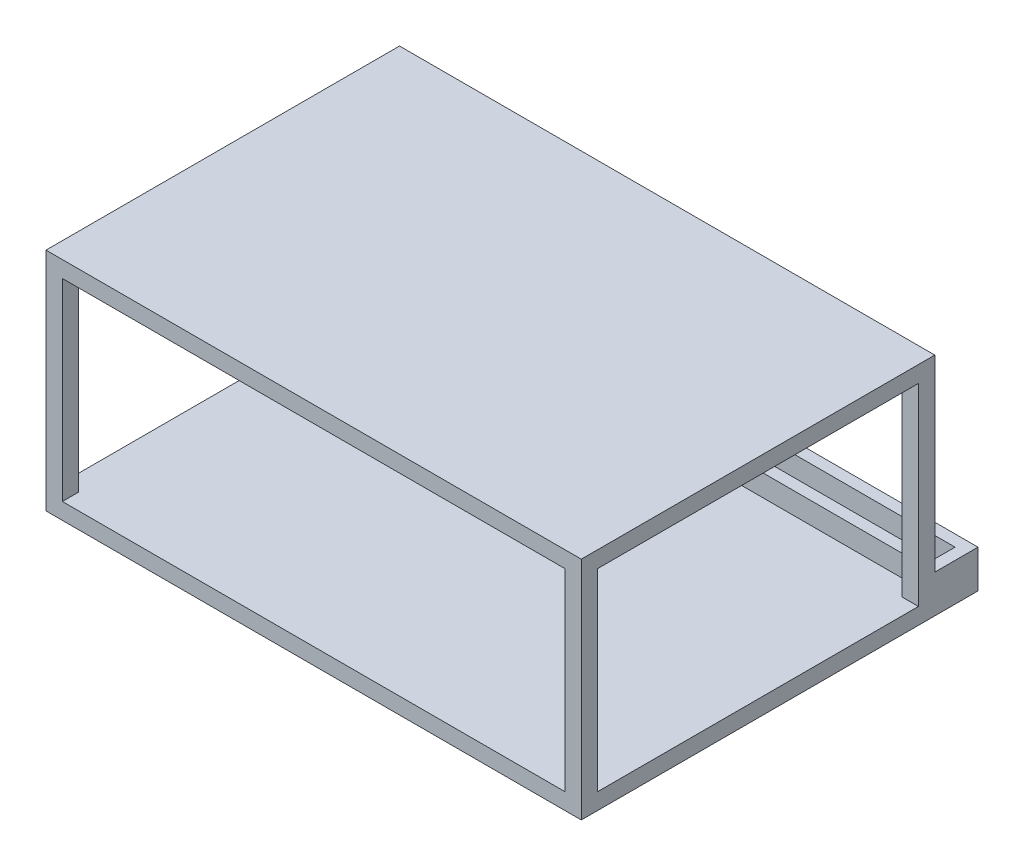
ISO-10303-21;
HEADER;
FILE_DESCRIPTION(('STEP AP214'),'2;1');
FILE_NAME('part.step','',(''),(''),'','','');
FILE_SCHEMA(('AUTOMOTIVE_DESIGN { 1 0 10303 214 1 1 1 1 }'));
ENDSEC;
DATA;
#1=APPLICATION_CONTEXT('core data for automotive mechanical design processes');
#2=APPLICATION_PROTOCOL_DEFINITION('international standard','automotive_design',2000,#1);
#3=PRODUCT_CONTEXT('',#1,'mechanical');
#4=PRODUCT('Part','Part','',(#3));
#5=PRODUCT_RELATED_PRODUCT_CATEGORY('part','',(#4));
#6=PRODUCT_DEFINITION_FORMATION('','',#4);
#7=PRODUCT_DEFINITION_CONTEXT('part definition',#1,'design');
#8=PRODUCT_DEFINITION('design','',#6,#7);
#9=PRODUCT_DEFINITION_SHAPE('','',#8);
#10=(LENGTH_UNIT() NAMED_UNIT(*) SI_UNIT(.MILLI.,.METRE.));
#11=(NAMED_UNIT(*) PLANE_ANGLE_UNIT() SI_UNIT($,.RADIAN.));
#12=(NAMED_UNIT(*) SI_UNIT($,.STERADIAN.) SOLID_ANGLE_UNIT());
#13=UNCERTAINTY_MEASURE_WITH_UNIT(LENGTH_MEASURE(1.E-05),#10,'distance_accuracy_value','');
#14=(GEOMETRIC_REPRESENTATION_CONTEXT(3) GLOBAL_UNCERTAINTY_ASSIGNED_CONTEXT((#13)) GLOBAL_UNIT_ASSIGNED_CONTEXT((#10,
#11,#12)) REPRESENTATION_CONTEXT('',''));
#15=CARTESIAN_POINT('',(0.,0.,0.));
#16=DIRECTION('',(0.,0.,1.));
#17=DIRECTION('',(1.,0.,0.));
#18=AXIS2_PLACEMENT_3D('',#15,#16,#17);
#19=CARTESIAN_POINT('',(43.8221663765315,10.,-23.125831873335));
#20=DIRECTION('',(0.,0.,-1.));
#21=DIRECTION('',(-1.,0.,0.));
#22=AXIS2_PLACEMENT_3D('',#19,#20,#21);
#23=PLANE('',#22);
#24=DIRECTION('',(-1.,0.,0.));
#25=VECTOR('',#24,1.);
#26=CARTESIAN_POINT('',(43.8221663765315,6.825,-23.125831873335));
#27=LINE('',#26,#25);
#28=CARTESIAN_POINT('',(-273.252833623469,6.825,-23.1258318733349));
#29=VERTEX_POINT('',#28);
#30=CARTESIAN_POINT('',(-283.252833623469,6.825,-23.125831873335));
#31=VERTEX_POINT('',#30);
#32=EDGE_CURVE('E260',#29,#31,#27,.T.);
#33=ORIENTED_EDGE('',*,*,#32,.F.);
#34=DIRECTION('',(0.,1.,0.));
#35=VECTOR('',#34,1.);
#36=CARTESIAN_POINT('',(-273.252833623469,10.,-23.125831873335));
#37=LINE('',#36,#35);
#38=CARTESIAN_POINT('',(-273.252833623469,124.85,-23.1258318733349));
#39=VERTEX_POINT('',#38);
#40=EDGE_CURVE('E232',#29,#39,#37,.T.);
#41=ORIENTED_EDGE('',*,*,#40,.T.);
#42=DIRECTION('',(-1.,0.,0.));
#43=VECTOR('',#42,1.);
#44=CARTESIAN_POINT('',(43.8221663765315,124.85,-23.125831873335));
#45=LINE('',#44,#43);
#46=CARTESIAN_POINT('',(-283.252833623469,124.85,-23.125831873335));
#47=VERTEX_POINT('',#46);
#48=EDGE_CURVE('E264',#39,#47,#45,.T.);
#49=ORIENTED_EDGE('',*,*,#48,.T.);
#50=DIRECTION('',(0.,-1.,0.));
#51=VECTOR('',#50,1.);
#52=CARTESIAN_POINT('',(-283.252833623469,10.,-23.125831873335));
#53=LINE('',#52,#51);
#54=EDGE_CURVE('E252',#47,#31,#53,.T.);
#55=ORIENTED_EDGE('',*,*,#54,.T.);
#56=EDGE_LOOP('',(#33,#41,#49,#55));
#57=FACE_BOUND('',#56,.T.);
#58=ADVANCED_FACE('F33',(#57),#23,.F.);
#59=CARTESIAN_POINT('',(43.8221663765315,6.825,172.874168126665));
#60=DIRECTION('',(0.,0.,1.));
#61=DIRECTION('',(1.,0.,0.));
#62=AXIS2_PLACEMENT_3D('',#59,#60,#61);
#63=PLANE('',#62);
#64=DIRECTION('',(-1.,0.,0.));
#65=VECTOR('',#64,1.);
#66=CARTESIAN_POINT('',(43.8221663765315,124.85,172.874168126665));
#67=LINE('',#66,#65);
#68=CARTESIAN_POINT('',(-273.252833623469,124.85,172.874168126665));
#69=VERTEX_POINT('',#68);
#70=CARTESIAN_POINT('',(-283.252833623469,124.85,172.874168126665));
#71=VERTEX_POINT('',#70);
#72=EDGE_CURVE('E266',#69,#71,#67,.T.);
#73=ORIENTED_EDGE('',*,*,#72,.F.);
#74=DIRECTION('',(0.,-1.,0.));
#75=VECTOR('',#74,1.);
#76=CARTESIAN_POINT('',(-273.252833623469,6.825,172.874168126665));
#77=LINE('',#76,#75);
#78=CARTESIAN_POINT('',(-273.252833623469,6.825,172.874168126665));
#79=VERTEX_POINT('',#78);
#80=EDGE_CURVE('E11',#69,#79,#77,.T.);
#81=ORIENTED_EDGE('',*,*,#80,.T.);
#82=DIRECTION('',(-1.,0.,0.));
#83=VECTOR('',#82,1.);
#84=CARTESIAN_POINT('',(43.8221663765315,6.825,172.874168126665));
#85=LINE('',#84,#83);
#86=CARTESIAN_POINT('',(-283.252833623469,6.825,172.874168126665));
#87=VERTEX_POINT('',#86);
#88=EDGE_CURVE('E255',#79,#87,#85,.T.);
#89=ORIENTED_EDGE('',*,*,#88,.T.);
#90=DIRECTION('',(0.,1.,0.));
#91=VECTOR('',#90,1.);
#92=CARTESIAN_POINT('',(-283.252833623469,6.825,172.874168126665));
#93=LINE('',#92,#91);
#94=EDGE_CURVE('E246',#87,#71,#93,.T.);
#95=ORIENTED_EDGE('',*,*,#94,.T.);
#96=EDGE_LOOP('',(#73,#81,#89,#95));
#97=FACE_BOUND('',#96,.T.);
#98=ADVANCED_FACE('F422',(#97),#63,.F.);
#99=CARTESIAN_POINT('',(0.,20.,0.));
#100=DIRECTION('',(0.,1.,0.));
#101=DIRECTION('',(0.,0.,1.));
#102=AXIS2_PLACEMENT_3D('',#99,#100,#101);
#103=PLANE('',#102);
#104=DIRECTION('',(1.,0.,0.));
#105=VECTOR('',#104,1.);
#106=CARTESIAN_POINT('',(-283.252833623469,20.,-33.125831873335));
#107=LINE('',#106,#105);
#108=CARTESIAN_POINT('',(-283.252833623469,20.,-33.125831873335));
#109=VERTEX_POINT('',#108);
#110=CARTESIAN_POINT('',(-273.252833623469,20.,-33.125831873335));
#111=VERTEX_POINT('',#110);
#112=EDGE_CURVE('E334',#109,#111,#107,.T.);
#113=ORIENTED_EDGE('',*,*,#112,.T.);
#114=CARTESIAN_POINT('',(33.8211663765314,20.,-33.125831873335));
#115=VERTEX_POINT('',#114);
#116=EDGE_CURVE('E338',#111,#115,#107,.T.);
#117=ORIENTED_EDGE('',*,*,#116,.T.);
#118=CARTESIAN_POINT('',(43.8211663765314,20.,-33.125831873335));
#119=VERTEX_POINT('',#118);
#120=EDGE_CURVE('E333',#115,#119,#107,.T.);
#121=ORIENTED_EDGE('',*,*,#120,.T.);
#122=DIRECTION('',(0.,0.,-1.));
#123=VECTOR('',#122,1.);
#124=CARTESIAN_POINT('',(43.8211663765314,20.,-33.125831873335));
#125=LINE('',#124,#123);
#126=CARTESIAN_POINT('',(43.8211663765314,20.,-59.5258318733349));
#127=VERTEX_POINT('',#126);
#128=EDGE_CURVE('E337',#119,#127,#125,.T.);
#129=ORIENTED_EDGE('',*,*,#128,.T.);
#130=DIRECTION('',(-1.,0.,0.));
#131=VECTOR('',#130,1.);
#132=CARTESIAN_POINT('',(-283.252833623469,20.,-59.5258318733349));
#133=LINE('',#132,#131);
#134=CARTESIAN_POINT('',(-283.252833623469,20.,-59.5258318733349));
#135=VERTEX_POINT('',#134);
#136=EDGE_CURVE('E340',#127,#135,#133,.T.);
#137=ORIENTED_EDGE('',*,*,#136,.T.);
#138=DIRECTION('',(0.,0.,1.));
#139=VECTOR('',#138,1.);
#140=CARTESIAN_POINT('',(-283.252833623469,20.,-33.125831873335));
#141=LINE('',#140,#139);
#142=EDGE_CURVE('E342',#135,#109,#141,.T.);
#143=ORIENTED_EDGE('',*,*,#142,.T.);
#144=EDGE_LOOP('',(#113,#117,#121,#129,#137,#143));
#145=FACE_BOUND('',#144,.T.);
#146=DIRECTION('',(1.,0.,0.));
#147=VECTOR('',#146,1.);
#148=CARTESIAN_POINT('',(-276.252833623469,20.,-40.125831873335));
#149=LINE('',#148,#147);
#150=CARTESIAN_POINT('',(-276.252833623469,20.,-40.125831873335));
#151=VERTEX_POINT('',#150);
#152=CARTESIAN_POINT('',(36.8211663765314,20.,-40.125831873335));
#153=VERTEX_POINT('',#152);
#154=EDGE_CURVE('E306',#151,#153,#149,.T.);
#155=ORIENTED_EDGE('',*,*,#154,.F.);
#156=DIRECTION('',(0.,0.,1.));
#157=VECTOR('',#156,1.);
#158=CARTESIAN_POINT('',(-276.252833623469,20.,-40.125831873335));
#159=LINE('',#158,#157);
#160=CARTESIAN_POINT('',(-276.252833623469,20.,-52.525831873335));
#161=VERTEX_POINT('',#160);
#162=EDGE_CURVE('E304',#161,#151,#159,.T.);
#163=ORIENTED_EDGE('',*,*,#162,.F.);
#164=DIRECTION('',(-1.,0.,0.));
#165=VECTOR('',#164,1.);
#166=CARTESIAN_POINT('',(-276.252833623469,20.,-52.525831873335));
#167=LINE('',#166,#165);
#168=CARTESIAN_POINT('',(36.8211663765314,20.,-52.525831873335));
#169=VERTEX_POINT('',#168);
#170=EDGE_CURVE('E312',#169,#161,#167,.T.);
#171=ORIENTED_EDGE('',*,*,#170,.F.);
#172=DIRECTION('',(0.,0.,-1.));
#173=VECTOR('',#172,1.);
#174=CARTESIAN_POINT('',(36.8211663765314,20.,-40.125831873335));
#175=LINE('',#174,#173);
#176=EDGE_CURVE('E309',#153,#169,#175,.T.);
#177=ORIENTED_EDGE('',*,*,#176,.F.);
#178=EDGE_LOOP('',(#155,#163,#171,#177));
#179=FACE_BOUND('',#178,.T.);
#180=ADVANCED_FACE('F387',(#145,#179),#103,.T.);
#181=CARTESIAN_POINT('',(43.8211663765314,20.,-33.125831873335));
#182=DIRECTION('',(-1.,0.,0.));
#183=DIRECTION('',(0.,0.,1.));
#184=AXIS2_PLACEMENT_3D('',#181,#182,#183);
#185=PLANE('',#184);
#186=DIRECTION('',(0.,1.,0.));
#187=VECTOR('',#186,1.);
#188=CARTESIAN_POINT('',(43.8211663765314,10.,-23.125831873335));
#189=LINE('',#188,#187);
#190=CARTESIAN_POINT('',(43.8211663765314,6.825,-23.125831873335));
#191=VERTEX_POINT('',#190);
#192=CARTESIAN_POINT('',(43.8211663765314,124.85,-23.125831873335));
#193=VERTEX_POINT('',#192);
#194=EDGE_CURVE('E237',#191,#193,#189,.T.);
#195=ORIENTED_EDGE('',*,*,#194,.F.);
#196=DIRECTION('',(0.,0.,-1.));
#197=VECTOR('',#196,1.);
#198=CARTESIAN_POINT('',(43.8211663765314,6.825,-23.125831873335));
#199=LINE('',#198,#197);
#200=CARTESIAN_POINT('',(43.8211663765314,6.825,172.874168126665));
#201=VERTEX_POINT('',#200);
#202=EDGE_CURVE('E240',#201,#191,#199,.T.);
#203=ORIENTED_EDGE('',*,*,#202,.F.);
#204=DIRECTION('',(0.,-1.,0.));
#205=VECTOR('',#204,1.);
#206=CARTESIAN_POINT('',(43.8211663765314,6.825,172.874168126665));
#207=LINE('',#206,#205);
#208=CARTESIAN_POINT('',(43.8211663765314,124.85,172.874168126665));
#209=VERTEX_POINT('',#208);
#210=EDGE_CURVE('E259',#209,#201,#207,.T.);
#211=ORIENTED_EDGE('',*,*,#210,.F.);
#212=DIRECTION('',(0.,0.,1.));
#213=VECTOR('',#212,1.);
#214=CARTESIAN_POINT('',(43.8211663765314,124.85,172.874168126665));
#215=LINE('',#214,#213);
#216=EDGE_CURVE('E235',#193,#209,#215,.T.);
#217=ORIENTED_EDGE('',*,*,#216,.F.);
#218=EDGE_LOOP('',(#195,#203,#211,#217));
#219=FACE_BOUND('',#218,.T.);
#220=ORIENTED_EDGE('',*,*,#128,.F.);
#221=DIRECTION('',(0.,-1.,0.));
#222=VECTOR('',#221,1.);
#223=CARTESIAN_POINT('',(43.8211663765314,134.85,-33.125831873335));
#224=LINE('',#223,#222);
#225=CARTESIAN_POINT('',(43.8211663765314,134.85,-33.125831873335));
#226=VERTEX_POINT('',#225);
#227=EDGE_CURVE('E286',#226,#119,#224,.T.);
#228=ORIENTED_EDGE('',*,*,#227,.F.);
#229=DIRECTION('',(0.,0.,-1.));
#230=VECTOR('',#229,1.);
#231=CARTESIAN_POINT('',(43.8211663765314,134.85,182.874168126665));
#232=LINE('',#231,#230);
#233=CARTESIAN_POINT('',(43.8211663765314,134.85,182.874168126665));
#234=VERTEX_POINT('',#233);
#235=EDGE_CURVE('E272',#234,#226,#232,.T.);
#236=ORIENTED_EDGE('',*,*,#235,.F.);
#237=DIRECTION('',(0.,1.,0.));
#238=VECTOR('',#237,1.);
#239=CARTESIAN_POINT('',(43.8211663765314,-3.175,182.874168126665));
#240=LINE('',#239,#238);
#241=CARTESIAN_POINT('',(43.8211663765314,-3.175,182.874168126665));
#242=VERTEX_POINT('',#241);
#243=EDGE_CURVE('E301',#242,#234,#240,.T.);
#244=ORIENTED_EDGE('',*,*,#243,.F.);
#245=DIRECTION('',(0.,0.,1.));
#246=VECTOR('',#245,1.);
#247=CARTESIAN_POINT('',(43.8211663765314,-3.175,-59.5258318733349));
#248=LINE('',#247,#246);
#249=CARTESIAN_POINT('',(43.8211663765314,-3.175,-59.5258318733349));
#250=VERTEX_POINT('',#249);
#251=EDGE_CURVE('E295',#250,#242,#248,.T.);
#252=ORIENTED_EDGE('',*,*,#251,.F.);
#253=DIRECTION('',(0.,-1.,0.));
#254=VECTOR('',#253,1.);
#255=CARTESIAN_POINT('',(43.8211663765314,20.,-59.5258318733349));
#256=LINE('',#255,#254);
#257=EDGE_CURVE('E347',#127,#250,#256,.T.);
#258=ORIENTED_EDGE('',*,*,#257,.F.);
#259=EDGE_LOOP('',(#220,#228,#236,#244,#252,#258));
#260=FACE_BOUND('',#259,.T.);
#261=ADVANCED_FACE('F35',(#219,#260),#185,.F.);
#262=CARTESIAN_POINT('',(-283.252833623469,20.,-59.5258318733349));
#263=DIRECTION('',(0.,0.,1.));
#264=DIRECTION('',(1.,0.,0.));
#265=AXIS2_PLACEMENT_3D('',#262,#263,#264);
#266=PLANE('',#265);
#267=ORIENTED_EDGE('',*,*,#257,.T.);
#268=DIRECTION('',(1.,0.,0.));
#269=VECTOR('',#268,1.);
#270=CARTESIAN_POINT('',(-283.252833623469,-3.175,-59.5258318733349));
#271=LINE('',#270,#269);
#272=CARTESIAN_POINT('',(-283.252833623469,-3.175,-59.5258318733349));
#273=VERTEX_POINT('',#272);
#274=EDGE_CURVE('E292',#273,#250,#271,.T.);
#275=ORIENTED_EDGE('',*,*,#274,.F.);
#276=DIRECTION('',(0.,-1.,0.));
#277=VECTOR('',#276,1.);
#278=CARTESIAN_POINT('',(-283.252833623469,20.,-59.5258318733349));
#279=LINE('',#278,#277);
#280=EDGE_CURVE('E345',#135,#273,#279,.T.);
#281=ORIENTED_EDGE('',*,*,#280,.F.);
#282=ORIENTED_EDGE('',*,*,#136,.F.);
#283=EDGE_LOOP('',(#267,#275,#281,#282));
#284=FACE_BOUND('',#283,.T.);
#285=ADVANCED_FACE('F408',(#284),#266,.F.);
#286=CARTESIAN_POINT('',(-283.252833623469,20.,-33.125831873335));
#287=DIRECTION('',(1.,0.,0.));
#288=DIRECTION('',(0.,0.,-1.));
#289=AXIS2_PLACEMENT_3D('',#286,#287,#288);
#290=PLANE('',#289);
#291=ORIENTED_EDGE('',*,*,#94,.F.);
#292=DIRECTION('',(0.,0.,1.));
#293=VECTOR('',#292,1.);
#294=CARTESIAN_POINT('',(-283.252833623469,6.825,-23.125831873335));
#295=LINE('',#294,#293);
#296=EDGE_CURVE('E243',#31,#87,#295,.T.);
#297=ORIENTED_EDGE('',*,*,#296,.F.);
#298=ORIENTED_EDGE('',*,*,#54,.F.);
#299=DIRECTION('',(0.,0.,-1.));
#300=VECTOR('',#299,1.);
#301=CARTESIAN_POINT('',(-283.252833623469,124.85,172.874168126665));
#302=LINE('',#301,#300);
#303=EDGE_CURVE('E249',#71,#47,#302,.T.);
#304=ORIENTED_EDGE('',*,*,#303,.F.);
#305=EDGE_LOOP('',(#291,#297,#298,#304));
#306=FACE_BOUND('',#305,.T.);
#307=ORIENTED_EDGE('',*,*,#280,.T.);
#308=DIRECTION('',(0.,0.,-1.));
#309=VECTOR('',#308,1.);
#310=CARTESIAN_POINT('',(-283.252833623469,-3.175,-59.5258318733349));
#311=LINE('',#310,#309);
#312=CARTESIAN_POINT('',(-283.252833623469,-3.175,182.874168126665));
#313=VERTEX_POINT('',#312);
#314=EDGE_CURVE('E289',#313,#273,#311,.T.);
#315=ORIENTED_EDGE('',*,*,#314,.F.);
#316=DIRECTION('',(0.,1.,0.));
#317=VECTOR('',#316,1.);
#318=CARTESIAN_POINT('',(-283.252833623469,-3.175,182.874168126665));
#319=LINE('',#318,#317);
#320=CARTESIAN_POINT('',(-283.252833623469,134.85,182.874168126665));
#321=VERTEX_POINT('',#320);
#322=EDGE_CURVE('E299',#313,#321,#319,.T.);
#323=ORIENTED_EDGE('',*,*,#322,.T.);
#324=DIRECTION('',(0.,0.,1.));
#325=VECTOR('',#324,1.);
#326=CARTESIAN_POINT('',(-283.252833623469,134.85,-33.125831873335));
#327=LINE('',#326,#325);
#328=CARTESIAN_POINT('',(-283.252833623469,134.85,-33.125831873335));
#329=VERTEX_POINT('',#328);
#330=EDGE_CURVE('E277',#329,#321,#327,.T.);
#331=ORIENTED_EDGE('',*,*,#330,.F.);
#332=DIRECTION('',(0.,-1.,0.));
#333=VECTOR('',#332,1.);
#334=CARTESIAN_POINT('',(-283.252833623469,134.85,-33.125831873335));
#335=LINE('',#334,#333);
#336=EDGE_CURVE('E283',#329,#109,#335,.T.);
#337=ORIENTED_EDGE('',*,*,#336,.T.);
#338=ORIENTED_EDGE('',*,*,#142,.F.);
#339=EDGE_LOOP('',(#307,#315,#323,#331,#337,#338));
#340=FACE_BOUND('',#339,.T.);
#341=ADVANCED_FACE('F393',(#306,#340),#290,.F.);
#342=CARTESIAN_POINT('',(-276.252833623469,20.,-40.125831873335));
#343=DIRECTION('',(1.,0.,0.));
#344=DIRECTION('',(0.,0.,-1.));
#345=AXIS2_PLACEMENT_3D('',#342,#343,#344);
#346=PLANE('',#345);
#347=DIRECTION('',(0.,0.,1.));
#348=VECTOR('',#347,1.);
#349=CARTESIAN_POINT('',(-276.252833623469,0.,-40.125831873335));
#350=LINE('',#349,#348);
#351=CARTESIAN_POINT('',(-276.252833623469,0.,-52.525831873335));
#352=VERTEX_POINT('',#351);
#353=CARTESIAN_POINT('',(-276.252833623469,0.,-40.125831873335));
#354=VERTEX_POINT('',#353);
#355=EDGE_CURVE('E303',#352,#354,#350,.T.);
#356=ORIENTED_EDGE('',*,*,#355,.F.);
#357=DIRECTION('',(0.,-1.,0.));
#358=VECTOR('',#357,1.);
#359=CARTESIAN_POINT('',(-276.252833623469,20.,-52.525831873335));
#360=LINE('',#359,#358);
#361=EDGE_CURVE('E314',#161,#352,#360,.T.);
#362=ORIENTED_EDGE('',*,*,#361,.F.);
#363=ORIENTED_EDGE('',*,*,#162,.T.);
#364=DIRECTION('',(0.,-1.,0.));
#365=VECTOR('',#364,1.);
#366=CARTESIAN_POINT('',(-276.252833623469,20.,-40.125831873335));
#367=LINE('',#366,#365);
#368=EDGE_CURVE('E330',#151,#354,#367,.T.);
#369=ORIENTED_EDGE('',*,*,#368,.T.);
#370=EDGE_LOOP('',(#356,#362,#363,#369));
#371=FACE_BOUND('',#370,.T.);
#372=ADVANCED_FACE('F535',(#371),#346,.T.);
#373=CARTESIAN_POINT('',(-276.252833623469,20.,-40.125831873335));
#374=DIRECTION('',(0.,0.,-1.));
#375=DIRECTION('',(-1.,0.,0.));
#376=AXIS2_PLACEMENT_3D('',#373,#374,#375);
#377=PLANE('',#376);
#378=DIRECTION('',(1.,0.,0.));
#379=VECTOR('',#378,1.);
#380=CARTESIAN_POINT('',(-276.252833623469,0.,-40.125831873335));
#381=LINE('',#380,#379);
#382=CARTESIAN_POINT('',(36.8211663765314,0.,-40.125831873335));
#383=VERTEX_POINT('',#382);
#384=EDGE_CURVE('E317',#354,#383,#381,.T.);
#385=ORIENTED_EDGE('',*,*,#384,.F.);
#386=ORIENTED_EDGE('',*,*,#368,.F.);
#387=ORIENTED_EDGE('',*,*,#154,.T.);
#388=DIRECTION('',(0.,-1.,0.));
#389=VECTOR('',#388,1.);
#390=CARTESIAN_POINT('',(36.8211663765314,20.,-40.125831873335));
#391=LINE('',#390,#389);
#392=EDGE_CURVE('E328',#153,#383,#391,.T.);
#393=ORIENTED_EDGE('',*,*,#392,.T.);
#394=EDGE_LOOP('',(#385,#386,#387,#393));
#395=FACE_BOUND('',#394,.T.);
#396=ADVANCED_FACE('F582',(#395),#377,.T.);
#397=CARTESIAN_POINT('',(36.8211663765314,20.,-40.125831873335));
#398=DIRECTION('',(-1.,0.,0.));
#399=DIRECTION('',(0.,0.,1.));
#400=AXIS2_PLACEMENT_3D('',#397,#398,#399);
#401=PLANE('',#400);
#402=DIRECTION('',(0.,0.,-1.));
#403=VECTOR('',#402,1.);
#404=CARTESIAN_POINT('',(36.8211663765314,0.,-40.125831873335));
#405=LINE('',#404,#403);
#406=CARTESIAN_POINT('',(36.8211663765314,0.,-52.525831873335));
#407=VERTEX_POINT('',#406);
#408=EDGE_CURVE('E320',#383,#407,#405,.T.);
#409=ORIENTED_EDGE('',*,*,#408,.F.);
#410=ORIENTED_EDGE('',*,*,#392,.F.);
#411=ORIENTED_EDGE('',*,*,#176,.T.);
#412=DIRECTION('',(0.,-1.,0.));
#413=VECTOR('',#412,1.);
#414=CARTESIAN_POINT('',(36.8211663765314,20.,-52.525831873335));
#415=LINE('',#414,#413);
#416=EDGE_CURVE('E326',#169,#407,#415,.T.);
#417=ORIENTED_EDGE('',*,*,#416,.T.);
#418=EDGE_LOOP('',(#409,#410,#411,#417));
#419=FACE_BOUND('',#418,.T.);
#420=ADVANCED_FACE('F572',(#419),#401,.T.);
#421=CARTESIAN_POINT('',(-276.252833623469,20.,-52.525831873335));
#422=DIRECTION('',(0.,0.,1.));
#423=DIRECTION('',(1.,0.,0.));
#424=AXIS2_PLACEMENT_3D('',#421,#422,#423);
#425=PLANE('',#424);
#426=DIRECTION('',(-1.,0.,0.));
#427=VECTOR('',#426,1.);
#428=CARTESIAN_POINT('',(-276.252833623469,0.,-52.525831873335));
#429=LINE('',#428,#427);
#430=EDGE_CURVE('E307',#407,#352,#429,.T.);
#431=ORIENTED_EDGE('',*,*,#430,.F.);
#432=ORIENTED_EDGE('',*,*,#416,.F.);
#433=ORIENTED_EDGE('',*,*,#170,.T.);
#434=ORIENTED_EDGE('',*,*,#361,.T.);
#435=EDGE_LOOP('',(#431,#432,#433,#434));
#436=FACE_BOUND('',#435,.T.);
#437=ADVANCED_FACE('F563',(#436),#425,.T.);
#438=CARTESIAN_POINT('',(0.,0.,0.));
#439=DIRECTION('',(0.,1.,0.));
#440=DIRECTION('',(0.,0.,1.));
#441=AXIS2_PLACEMENT_3D('',#438,#439,#440);
#442=PLANE('',#441);
#443=ORIENTED_EDGE('',*,*,#430,.T.);
#444=ORIENTED_EDGE('',*,*,#355,.T.);
#445=ORIENTED_EDGE('',*,*,#384,.T.);
#446=ORIENTED_EDGE('',*,*,#408,.T.);
#447=EDGE_LOOP('',(#443,#444,#445,#446));
#448=FACE_BOUND('',#447,.T.);
#449=ADVANCED_FACE('F418',(#448),#442,.T.);
#450=CARTESIAN_POINT('',(-283.252833623469,-3.175,182.874168126665));
#451=DIRECTION('',(0.,0.,-1.));
#452=DIRECTION('',(-1.,0.,0.));
#453=AXIS2_PLACEMENT_3D('',#450,#451,#452);
#454=PLANE('',#453);
#455=DIRECTION('',(0.,1.,0.));
#456=VECTOR('',#455,1.);
#457=CARTESIAN_POINT('',(33.8211663765314,6.825,182.874168126665));
#458=LINE('',#457,#456);
#459=CARTESIAN_POINT('',(33.8211663765314,6.825,182.874168126665));
#460=VERTEX_POINT('',#459);
#461=CARTESIAN_POINT('',(33.8211663765314,124.85,182.874168126665));
#462=VERTEX_POINT('',#461);
#463=EDGE_CURVE('E204',#460,#462,#458,.T.);
#464=ORIENTED_EDGE('',*,*,#463,.F.);
#465=DIRECTION('',(1.,0.,0.));
#466=VECTOR('',#465,1.);
#467=CARTESIAN_POINT('',(-273.252833623469,6.825,182.874168126665));
#468=LINE('',#467,#466);
#469=CARTESIAN_POINT('',(-273.252833623469,6.825,182.874168126665));
#470=VERTEX_POINT('',#469);
#471=EDGE_CURVE('E48',#470,#460,#468,.T.);
#472=ORIENTED_EDGE('',*,*,#471,.F.);
#473=DIRECTION('',(0.,-1.,0.));
#474=VECTOR('',#473,1.);
#475=CARTESIAN_POINT('',(-273.252833623469,124.85,182.874168126665));
#476=LINE('',#475,#474);
#477=CARTESIAN_POINT('',(-273.252833623469,124.85,182.874168126665));
#478=VERTEX_POINT('',#477);
#479=EDGE_CURVE('E212',#478,#470,#476,.T.);
#480=ORIENTED_EDGE('',*,*,#479,.F.);
#481=DIRECTION('',(-1.,0.,0.));
#482=VECTOR('',#481,1.);
#483=CARTESIAN_POINT('',(33.8211663765314,124.85,182.874168126665));
#484=LINE('',#483,#482);
#485=EDGE_CURVE('E195',#462,#478,#484,.T.);
#486=ORIENTED_EDGE('',*,*,#485,.F.);
#487=EDGE_LOOP('',(#464,#472,#480,#486));
#488=FACE_BOUND('',#487,.T.);
#489=ORIENTED_EDGE('',*,*,#243,.T.);
#490=DIRECTION('',(1.,0.,0.));
#491=VECTOR('',#490,1.);
#492=CARTESIAN_POINT('',(-283.252833623469,134.85,182.874168126665));
#493=LINE('',#492,#491);
#494=EDGE_CURVE('E280',#321,#234,#493,.T.);
#495=ORIENTED_EDGE('',*,*,#494,.F.);
#496=ORIENTED_EDGE('',*,*,#322,.F.);
#497=DIRECTION('',(-1.,0.,0.));
#498=VECTOR('',#497,1.);
#499=CARTESIAN_POINT('',(-283.252833623469,-3.175,182.874168126665));
#500=LINE('',#499,#498);
#501=EDGE_CURVE('E297',#242,#313,#500,.T.);
#502=ORIENTED_EDGE('',*,*,#501,.F.);
#503=EDGE_LOOP('',(#489,#495,#496,#502));
#504=FACE_BOUND('',#503,.T.);
#505=ADVANCED_FACE('F209',(#488,#504),#454,.F.);
#506=CARTESIAN_POINT('',(0.,-3.175,0.));
#507=DIRECTION('',(0.,1.,0.));
#508=DIRECTION('',(0.,0.,1.));
#509=AXIS2_PLACEMENT_3D('',#506,#507,#508);
#510=PLANE('',#509);
#511=ORIENTED_EDGE('',*,*,#314,.T.);
#512=ORIENTED_EDGE('',*,*,#274,.T.);
#513=ORIENTED_EDGE('',*,*,#251,.T.);
#514=ORIENTED_EDGE('',*,*,#501,.T.);
#515=EDGE_LOOP('',(#511,#512,#513,#514));
#516=FACE_BOUND('',#515,.T.);
#517=ADVANCED_FACE('F410',(#516),#510,.F.);
#518=CARTESIAN_POINT('',(43.8211663765314,134.85,-33.125831873335));
#519=DIRECTION('',(0.,0.,1.));
#520=DIRECTION('',(1.,0.,0.));
#521=AXIS2_PLACEMENT_3D('',#518,#519,#520);
#522=PLANE('',#521);
#523=DIRECTION('',(1.,0.,0.));
#524=VECTOR('',#523,1.);
#525=CARTESIAN_POINT('',(33.8211663765314,124.85,-33.125831873335));
#526=LINE('',#525,#524);
#527=CARTESIAN_POINT('',(-273.252833623469,124.85,-33.125831873335));
#528=VERTEX_POINT('',#527);
#529=CARTESIAN_POINT('',(33.8211663765314,124.85,-33.125831873335));
#530=VERTEX_POINT('',#529);
#531=EDGE_CURVE('E220',#528,#530,#526,.T.);
#532=ORIENTED_EDGE('',*,*,#531,.F.);
#533=DIRECTION('',(0.,1.,0.));
#534=VECTOR('',#533,1.);
#535=CARTESIAN_POINT('',(-273.252833623469,124.85,-33.125831873335));
#536=LINE('',#535,#534);
#537=EDGE_CURVE('E372',#111,#528,#536,.T.);
#538=ORIENTED_EDGE('',*,*,#537,.F.);
#539=ORIENTED_EDGE('',*,*,#112,.F.);
#540=ORIENTED_EDGE('',*,*,#336,.F.);
#541=DIRECTION('',(-1.,0.,0.));
#542=VECTOR('',#541,1.);
#543=CARTESIAN_POINT('',(43.8211663765314,134.85,-33.125831873335));
#544=LINE('',#543,#542);
#545=EDGE_CURVE('E275',#226,#329,#544,.T.);
#546=ORIENTED_EDGE('',*,*,#545,.F.);
#547=ORIENTED_EDGE('',*,*,#227,.T.);
#548=ORIENTED_EDGE('',*,*,#120,.F.);
#549=DIRECTION('',(0.,-1.,0.));
#550=VECTOR('',#549,1.);
#551=CARTESIAN_POINT('',(33.8211663765314,6.825,-33.125831873335));
#552=LINE('',#551,#550);
#553=EDGE_CURVE('E226',#530,#115,#552,.T.);
#554=ORIENTED_EDGE('',*,*,#553,.F.);
#555=EDGE_LOOP('',(#532,#538,#539,#540,#546,#547,#548,#554));
#556=FACE_BOUND('',#555,.T.);
#557=ADVANCED_FACE('F382',(#556),#522,.F.);
#558=CARTESIAN_POINT('',(0.,134.85,0.));
#559=DIRECTION('',(0.,1.,0.));
#560=DIRECTION('',(0.,0.,1.));
#561=AXIS2_PLACEMENT_3D('',#558,#559,#560);
#562=PLANE('',#561);
#563=ORIENTED_EDGE('',*,*,#235,.T.);
#564=ORIENTED_EDGE('',*,*,#545,.T.);
#565=ORIENTED_EDGE('',*,*,#330,.T.);
#566=ORIENTED_EDGE('',*,*,#494,.T.);
#567=EDGE_LOOP('',(#563,#564,#565,#566));
#568=FACE_BOUND('',#567,.T.);
#569=ADVANCED_FACE('F398',(#568),#562,.T.);
#570=CARTESIAN_POINT('',(43.8221663765315,6.825,-23.125831873335));
#571=DIRECTION('',(0.,-1.,0.));
#572=DIRECTION('',(0.,0.,-1.));
#573=AXIS2_PLACEMENT_3D('',#570,#571,#572);
#574=PLANE('',#573);
#575=CARTESIAN_POINT('',(33.8211663765314,6.825,-23.125831873335));
#576=VERTEX_POINT('',#575);
#577=EDGE_CURVE('E256',#191,#576,#27,.T.);
#578=ORIENTED_EDGE('',*,*,#577,.T.);
#579=DIRECTION('',(0.,0.,1.));
#580=VECTOR('',#579,1.);
#581=CARTESIAN_POINT('',(33.8211663765314,6.825,-362.100514943324));
#582=LINE('',#581,#580);
#583=CARTESIAN_POINT('',(33.8211663765314,6.825,-33.125831873335));
#584=VERTEX_POINT('',#583);
#585=EDGE_CURVE('E201',#584,#576,#582,.T.);
#586=ORIENTED_EDGE('',*,*,#585,.F.);
#587=DIRECTION('',(-1.,0.,0.));
#588=VECTOR('',#587,1.);
#589=CARTESIAN_POINT('',(-273.252833623469,6.825,-33.125831873335));
#590=LINE('',#589,#588);
#591=CARTESIAN_POINT('',(-273.252833623469,6.825,-33.125831873335));
#592=VERTEX_POINT('',#591);
#593=EDGE_CURVE('E361',#584,#592,#590,.T.);
#594=ORIENTED_EDGE('',*,*,#593,.T.);
#595=DIRECTION('',(0.,0.,1.));
#596=VECTOR('',#595,1.);
#597=CARTESIAN_POINT('',(-273.252833623469,6.825,-362.100514943324));
#598=LINE('',#597,#596);
#599=EDGE_CURVE('E217',#592,#29,#598,.T.);
#600=ORIENTED_EDGE('',*,*,#599,.T.);
#601=ORIENTED_EDGE('',*,*,#32,.T.);
#602=ORIENTED_EDGE('',*,*,#296,.T.);
#603=ORIENTED_EDGE('',*,*,#88,.F.);
#604=EDGE_CURVE('E221',#79,#470,#598,.T.);
#605=ORIENTED_EDGE('',*,*,#604,.T.);
#606=ORIENTED_EDGE('',*,*,#471,.T.);
#607=CARTESIAN_POINT('',(33.8211663765314,6.825,172.874168126665));
#608=VERTEX_POINT('',#607);
#609=EDGE_CURVE('E206',#608,#460,#582,.T.);
#610=ORIENTED_EDGE('',*,*,#609,.F.);
#611=EDGE_CURVE('E267',#201,#608,#85,.T.);
#612=ORIENTED_EDGE('',*,*,#611,.F.);
#613=ORIENTED_EDGE('',*,*,#202,.T.);
#614=EDGE_LOOP('',(#578,#586,#594,#600,#601,#602,#603,#605,#606,#610,#612,#613));
#615=FACE_BOUND('',#614,.T.);
#616=ADVANCED_FACE('F351',(#615),#574,.F.);
#617=CARTESIAN_POINT('',(33.8211663765314,124.85,-23.1258318733349));
#618=VERTEX_POINT('',#617);
#619=EDGE_CURVE('E261',#193,#618,#45,.T.);
#620=ORIENTED_EDGE('',*,*,#619,.T.);
#621=DIRECTION('',(0.,-1.,0.));
#622=VECTOR('',#621,1.);
#623=CARTESIAN_POINT('',(33.8211663765314,10.,-23.125831873335));
#624=LINE('',#623,#622);
#625=EDGE_CURVE('E228',#618,#576,#624,.T.);
#626=ORIENTED_EDGE('',*,*,#625,.T.);
#627=ORIENTED_EDGE('',*,*,#577,.F.);
#628=ORIENTED_EDGE('',*,*,#194,.T.);
#629=EDGE_LOOP('',(#620,#626,#627,#628));
#630=FACE_BOUND('',#629,.T.);
#631=ADVANCED_FACE('F358',(#630),#23,.F.);
#632=CARTESIAN_POINT('',(43.8221663765315,124.85,172.874168126665));
#633=DIRECTION('',(0.,1.,0.));
#634=DIRECTION('',(0.,0.,1.));
#635=AXIS2_PLACEMENT_3D('',#632,#633,#634);
#636=PLANE('',#635);
#637=CARTESIAN_POINT('',(33.8211663765314,124.85,172.874168126665));
#638=VERTEX_POINT('',#637);
#639=EDGE_CURVE('E198',#209,#638,#67,.T.);
#640=ORIENTED_EDGE('',*,*,#639,.T.);
#641=DIRECTION('',(0.,0.,1.));
#642=VECTOR('',#641,1.);
#643=CARTESIAN_POINT('',(33.8211663765314,124.85,-362.100514943324));
#644=LINE('',#643,#642);
#645=EDGE_CURVE('E190',#638,#462,#644,.T.);
#646=ORIENTED_EDGE('',*,*,#645,.T.);
#647=ORIENTED_EDGE('',*,*,#485,.T.);
#648=DIRECTION('',(0.,0.,1.));
#649=VECTOR('',#648,1.);
#650=CARTESIAN_POINT('',(-273.252833623469,124.85,-362.100514943324));
#651=LINE('',#650,#649);
#652=EDGE_CURVE('E223',#69,#478,#651,.T.);
#653=ORIENTED_EDGE('',*,*,#652,.F.);
#654=ORIENTED_EDGE('',*,*,#72,.T.);
#655=ORIENTED_EDGE('',*,*,#303,.T.);
#656=ORIENTED_EDGE('',*,*,#48,.F.);
#657=EDGE_CURVE('E222',#528,#39,#651,.T.);
#658=ORIENTED_EDGE('',*,*,#657,.F.);
#659=ORIENTED_EDGE('',*,*,#531,.T.);
#660=EDGE_CURVE('E56',#530,#618,#644,.T.);
#661=ORIENTED_EDGE('',*,*,#660,.T.);
#662=ORIENTED_EDGE('',*,*,#619,.F.);
#663=ORIENTED_EDGE('',*,*,#216,.T.);
#664=EDGE_LOOP('',(#640,#646,#647,#653,#654,#655,#656,#658,#659,#661,#662,#663));
#665=FACE_BOUND('',#664,.T.);
#666=ADVANCED_FACE('F192',(#665),#636,.F.);
#667=ORIENTED_EDGE('',*,*,#611,.T.);
#668=DIRECTION('',(0.,1.,0.));
#669=VECTOR('',#668,1.);
#670=CARTESIAN_POINT('',(33.8211663765314,6.825,172.874168126665));
#671=LINE('',#670,#669);
#672=EDGE_CURVE('E41',#608,#638,#671,.T.);
#673=ORIENTED_EDGE('',*,*,#672,.T.);
#674=ORIENTED_EDGE('',*,*,#639,.F.);
#675=ORIENTED_EDGE('',*,*,#210,.T.);
#676=EDGE_LOOP('',(#667,#673,#674,#675));
#677=FACE_BOUND('',#676,.T.);
#678=ADVANCED_FACE('F349',(#677),#63,.F.);
#679=CARTESIAN_POINT('',(33.8211663765314,6.825,-362.100514943324));
#680=DIRECTION('',(1.,0.,0.));
#681=DIRECTION('',(0.,0.,-1.));
#682=AXIS2_PLACEMENT_3D('',#679,#680,#681);
#683=PLANE('',#682);
#684=ORIENTED_EDGE('',*,*,#609,.T.);
#685=ORIENTED_EDGE('',*,*,#463,.T.);
#686=ORIENTED_EDGE('',*,*,#645,.F.);
#687=ORIENTED_EDGE('',*,*,#672,.F.);
#688=EDGE_LOOP('',(#684,#685,#686,#687));
#689=FACE_BOUND('',#688,.T.);
#690=ADVANCED_FACE('F205',(#689),#683,.F.);
#691=CARTESIAN_POINT('',(-273.252833623469,124.85,-362.100514943324));
#692=DIRECTION('',(-1.,0.,0.));
#693=DIRECTION('',(0.,0.,1.));
#694=AXIS2_PLACEMENT_3D('',#691,#692,#693);
#695=PLANE('',#694);
#696=ORIENTED_EDGE('',*,*,#652,.T.);
#697=ORIENTED_EDGE('',*,*,#479,.T.);
#698=ORIENTED_EDGE('',*,*,#604,.F.);
#699=ORIENTED_EDGE('',*,*,#80,.F.);
#700=EDGE_LOOP('',(#696,#697,#698,#699));
#701=FACE_BOUND('',#700,.T.);
#702=ADVANCED_FACE('F447',(#701),#695,.F.);
#703=ORIENTED_EDGE('',*,*,#599,.F.);
#704=EDGE_CURVE('E369',#592,#111,#536,.T.);
#705=ORIENTED_EDGE('',*,*,#704,.T.);
#706=ORIENTED_EDGE('',*,*,#537,.T.);
#707=ORIENTED_EDGE('',*,*,#657,.T.);
#708=ORIENTED_EDGE('',*,*,#40,.F.);
#709=EDGE_LOOP('',(#703,#705,#706,#707,#708));
#710=FACE_BOUND('',#709,.T.);
#711=ADVANCED_FACE('F379',(#710),#695,.F.);
#712=ORIENTED_EDGE('',*,*,#660,.F.);
#713=ORIENTED_EDGE('',*,*,#553,.T.);
#714=EDGE_CURVE('E229',#115,#584,#552,.T.);
#715=ORIENTED_EDGE('',*,*,#714,.T.);
#716=ORIENTED_EDGE('',*,*,#585,.T.);
#717=ORIENTED_EDGE('',*,*,#625,.F.);
#718=EDGE_LOOP('',(#712,#713,#715,#716,#717));
#719=FACE_BOUND('',#718,.T.);
#720=ADVANCED_FACE('F363',(#719),#683,.F.);
#721=CARTESIAN_POINT('',(43.8211663765314,134.85,-33.125831873335));
#722=DIRECTION('',(0.,0.,1.));
#723=DIRECTION('',(1.,0.,0.));
#724=AXIS2_PLACEMENT_3D('',#721,#722,#723);
#725=PLANE('',#724);
#726=ORIENTED_EDGE('',*,*,#704,.F.);
#727=ORIENTED_EDGE('',*,*,#593,.F.);
#728=ORIENTED_EDGE('',*,*,#714,.F.);
#729=ORIENTED_EDGE('',*,*,#116,.F.);
#730=EDGE_LOOP('',(#726,#727,#728,#729));
#731=FACE_BOUND('',#730,.T.);
#732=ADVANCED_FACE('F367',(#731),#725,.T.);
#733=CLOSED_SHELL('',(#58,#98,#180,#261,#285,#341,#372,#396,#420,#437,#449,#505,#517,#557,#569,
#616,#631,#666,#678,#690,#702,#711,#720,#732));
#734=MANIFOLD_SOLID_BREP('B2',#733);
#735=ADVANCED_BREP_SHAPE_REPRESENTATION('',(#18,#734),#14);
#736=SHAPE_DEFINITION_REPRESENTATION(#9,#735);
ENDSEC;
END-ISO-10303-21;
